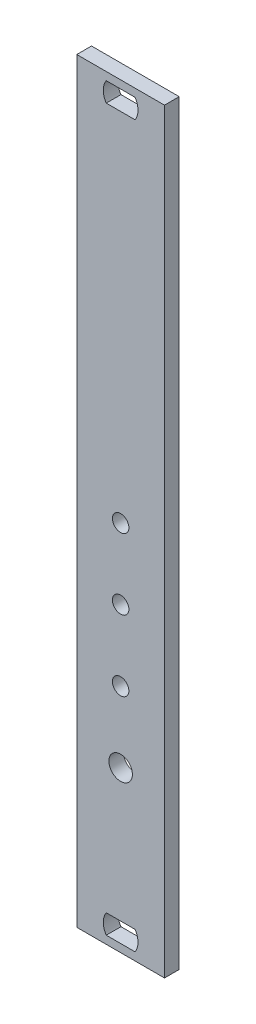
ISO-10303-21;
HEADER;
FILE_DESCRIPTION(('STEP AP214'),'2;1');
FILE_NAME('part.step','',(''),(''),'','','');
FILE_SCHEMA(('AUTOMOTIVE_DESIGN { 1 0 10303 214 1 1 1 1 }'));
ENDSEC;
DATA;
#1=APPLICATION_CONTEXT('core data for automotive mechanical design processes');
#2=APPLICATION_PROTOCOL_DEFINITION('international standard','automotive_design',2000,#1);
#3=PRODUCT_CONTEXT('',#1,'mechanical');
#4=PRODUCT('Part','Part','',(#3));
#5=PRODUCT_RELATED_PRODUCT_CATEGORY('part','',(#4));
#6=PRODUCT_DEFINITION_FORMATION('','',#4);
#7=PRODUCT_DEFINITION_CONTEXT('part definition',#1,'design');
#8=PRODUCT_DEFINITION('design','',#6,#7);
#9=PRODUCT_DEFINITION_SHAPE('','',#8);
#10=(LENGTH_UNIT() NAMED_UNIT(*) SI_UNIT(.MILLI.,.METRE.));
#11=(NAMED_UNIT(*) PLANE_ANGLE_UNIT() SI_UNIT($,.RADIAN.));
#12=(NAMED_UNIT(*) SI_UNIT($,.STERADIAN.) SOLID_ANGLE_UNIT());
#13=UNCERTAINTY_MEASURE_WITH_UNIT(LENGTH_MEASURE(1.E-05),#10,'distance_accuracy_value','');
#14=(GEOMETRIC_REPRESENTATION_CONTEXT(3) GLOBAL_UNCERTAINTY_ASSIGNED_CONTEXT((#13)) GLOBAL_UNIT_ASSIGNED_CONTEXT((#10,
#11,#12)) REPRESENTATION_CONTEXT('',''));
#15=CARTESIAN_POINT('',(0.,0.,0.));
#16=DIRECTION('',(0.,0.,1.));
#17=DIRECTION('',(1.,0.,0.));
#18=AXIS2_PLACEMENT_3D('',#15,#16,#17);
#19=CARTESIAN_POINT('',(0.,0.,2.5));
#20=DIRECTION('',(0.,0.,-1.));
#21=DIRECTION('',(-1.,0.,0.));
#22=AXIS2_PLACEMENT_3D('',#19,#20,#21);
#23=PLANE('',#22);
#24=CARTESIAN_POINT('',(7.45000000000001,27.2,2.5));
#25=DIRECTION('',(0.,0.,1.));
#26=DIRECTION('',(1.,0.,0.));
#27=AXIS2_PLACEMENT_3D('',#24,#25,#26);
#28=CIRCLE('',#27,2.);
#29=CARTESIAN_POINT('',(9.45,27.2,2.5));
#30=VERTEX_POINT('',#29);
#31=EDGE_CURVE('E321',#30,#30,#28,.T.);
#32=ORIENTED_EDGE('',*,*,#31,.F.);
#33=EDGE_LOOP('',(#32));
#34=FACE_BOUND('',#33,.T.);
#35=CARTESIAN_POINT('',(7.45,39.2,2.5));
#36=DIRECTION('',(0.,0.,1.));
#37=DIRECTION('',(1.,0.,0.));
#38=AXIS2_PLACEMENT_3D('',#35,#36,#37);
#39=CIRCLE('',#38,1.4);
#40=CARTESIAN_POINT('',(8.85,39.2,2.5));
#41=VERTEX_POINT('',#40);
#42=EDGE_CURVE('E323',#41,#41,#39,.T.);
#43=ORIENTED_EDGE('',*,*,#42,.F.);
#44=EDGE_LOOP('',(#43));
#45=FACE_BOUND('',#44,.T.);
#46=CARTESIAN_POINT('',(7.45,51.2,2.5));
#47=DIRECTION('',(0.,0.,1.));
#48=DIRECTION('',(1.,0.,0.));
#49=AXIS2_PLACEMENT_3D('',#46,#47,#48);
#50=CIRCLE('',#49,1.4);
#51=CARTESIAN_POINT('',(8.85,51.2,2.5));
#52=VERTEX_POINT('',#51);
#53=EDGE_CURVE('E329',#52,#52,#50,.T.);
#54=ORIENTED_EDGE('',*,*,#53,.F.);
#55=EDGE_LOOP('',(#54));
#56=FACE_BOUND('',#55,.T.);
#57=CARTESIAN_POINT('',(7.45,63.2,2.5));
#58=DIRECTION('',(0.,0.,1.));
#59=DIRECTION('',(1.,0.,0.));
#60=AXIS2_PLACEMENT_3D('',#57,#58,#59);
#61=CIRCLE('',#60,1.4);
#62=CARTESIAN_POINT('',(8.85,63.2,2.5));
#63=VERTEX_POINT('',#62);
#64=EDGE_CURVE('E335',#63,#63,#61,.T.);
#65=ORIENTED_EDGE('',*,*,#64,.F.);
#66=EDGE_LOOP('',(#65));
#67=FACE_BOUND('',#66,.T.);
#68=CARTESIAN_POINT('',(7.45000000000001,3.,2.5));
#69=DIRECTION('',(0.,0.,1.));
#70=DIRECTION('',(1.,0.,0.));
#71=AXIS2_PLACEMENT_3D('',#68,#69,#70);
#72=CIRCLE('',#71,2.95);
#73=CARTESIAN_POINT('',(5.00459614787252,4.65,2.5));
#74=VERTEX_POINT('',#73);
#75=CARTESIAN_POINT('',(5.00459614787252,1.35,2.5));
#76=VERTEX_POINT('',#75);
#77=EDGE_CURVE('E161',#74,#76,#72,.T.);
#78=ORIENTED_EDGE('',*,*,#77,.F.);
#79=DIRECTION('',(-1.,0.,0.));
#80=VECTOR('',#79,1.);
#81=CARTESIAN_POINT('',(5.00459614787252,4.65,2.5));
#82=LINE('',#81,#80);
#83=CARTESIAN_POINT('',(9.89540385212751,4.65,2.5));
#84=VERTEX_POINT('',#83);
#85=EDGE_CURVE('E169',#84,#74,#82,.T.);
#86=ORIENTED_EDGE('',*,*,#85,.F.);
#87=CARTESIAN_POINT('',(7.45000000000001,3.,2.5));
#88=DIRECTION('',(0.,0.,1.));
#89=DIRECTION('',(1.,0.,0.));
#90=AXIS2_PLACEMENT_3D('',#87,#88,#89);
#91=CIRCLE('',#90,2.95);
#92=CARTESIAN_POINT('',(9.89540385212751,1.35,2.5));
#93=VERTEX_POINT('',#92);
#94=EDGE_CURVE('E166',#93,#84,#91,.T.);
#95=ORIENTED_EDGE('',*,*,#94,.F.);
#96=DIRECTION('',(1.,0.,0.));
#97=VECTOR('',#96,1.);
#98=CARTESIAN_POINT('',(9.89540385212751,1.35,2.5));
#99=LINE('',#98,#97);
#100=EDGE_CURVE('E163',#76,#93,#99,.T.);
#101=ORIENTED_EDGE('',*,*,#100,.F.);
#102=EDGE_LOOP('',(#78,#86,#95,#101));
#103=FACE_BOUND('',#102,.T.);
#104=DIRECTION('',(0.,-1.,0.));
#105=VECTOR('',#104,1.);
#106=CARTESIAN_POINT('',(0.,0.,2.5));
#107=LINE('',#106,#105);
#108=CARTESIAN_POINT('',(0.,128.4,2.5));
#109=VERTEX_POINT('',#108);
#110=CARTESIAN_POINT('',(0.,0.,2.5));
#111=VERTEX_POINT('',#110);
#112=EDGE_CURVE('E192',#109,#111,#107,.T.);
#113=ORIENTED_EDGE('',*,*,#112,.T.);
#114=DIRECTION('',(1.,0.,0.));
#115=VECTOR('',#114,1.);
#116=CARTESIAN_POINT('',(14.9,0.,2.5));
#117=LINE('',#116,#115);
#118=CARTESIAN_POINT('',(14.9,0.,2.5));
#119=VERTEX_POINT('',#118);
#120=EDGE_CURVE('E195',#111,#119,#117,.T.);
#121=ORIENTED_EDGE('',*,*,#120,.T.);
#122=DIRECTION('',(0.,1.,0.));
#123=VECTOR('',#122,1.);
#124=CARTESIAN_POINT('',(14.9,128.4,2.5));
#125=LINE('',#124,#123);
#126=CARTESIAN_POINT('',(14.9,128.4,2.5));
#127=VERTEX_POINT('',#126);
#128=EDGE_CURVE('E198',#119,#127,#125,.T.);
#129=ORIENTED_EDGE('',*,*,#128,.T.);
#130=DIRECTION('',(-1.,0.,0.));
#131=VECTOR('',#130,1.);
#132=CARTESIAN_POINT('',(0.,128.4,2.5));
#133=LINE('',#132,#131);
#134=EDGE_CURVE('E200',#127,#109,#133,.T.);
#135=ORIENTED_EDGE('',*,*,#134,.T.);
#136=EDGE_LOOP('',(#113,#121,#129,#135));
#137=FACE_BOUND('',#136,.T.);
#138=CARTESIAN_POINT('',(7.45,125.4,2.5));
#139=DIRECTION('',(0.,0.,1.));
#140=DIRECTION('',(1.,0.,0.));
#141=AXIS2_PLACEMENT_3D('',#138,#139,#140);
#142=CIRCLE('',#141,2.95000000000001);
#143=CARTESIAN_POINT('',(5.00459614787251,127.05,2.5));
#144=VERTEX_POINT('',#143);
#145=CARTESIAN_POINT('',(5.00459614787247,123.75,2.5));
#146=VERTEX_POINT('',#145);
#147=EDGE_CURVE('E123',#144,#146,#142,.T.);
#148=ORIENTED_EDGE('',*,*,#147,.F.);
#149=DIRECTION('',(-1.,0.,0.));
#150=VECTOR('',#149,1.);
#151=CARTESIAN_POINT('',(5.00459614787251,127.05,2.5));
#152=LINE('',#151,#150);
#153=CARTESIAN_POINT('',(9.89540385212749,127.05,2.5));
#154=VERTEX_POINT('',#153);
#155=EDGE_CURVE('E145',#154,#144,#152,.T.);
#156=ORIENTED_EDGE('',*,*,#155,.F.);
#157=CARTESIAN_POINT('',(7.45,125.4,2.5));
#158=DIRECTION('',(0.,0.,1.));
#159=DIRECTION('',(1.,0.,0.));
#160=AXIS2_PLACEMENT_3D('',#157,#158,#159);
#161=CIRCLE('',#160,2.95000000000001);
#162=CARTESIAN_POINT('',(9.89540385212751,123.75,2.5));
#163=VERTEX_POINT('',#162);
#164=EDGE_CURVE('E143',#163,#154,#161,.T.);
#165=ORIENTED_EDGE('',*,*,#164,.F.);
#166=DIRECTION('',(1.,0.,0.));
#167=VECTOR('',#166,1.);
#168=CARTESIAN_POINT('',(9.89540385212753,123.75,2.5));
#169=LINE('',#168,#167);
#170=EDGE_CURVE('E131',#146,#163,#169,.T.);
#171=ORIENTED_EDGE('',*,*,#170,.F.);
#172=EDGE_LOOP('',(#148,#156,#165,#171));
#173=FACE_BOUND('',#172,.T.);
#174=ADVANCED_FACE('F34',(#34,#45,#56,#67,#103,#137,#173),#23,.F.);
#175=CARTESIAN_POINT('',(0.,0.,0.));
#176=DIRECTION('',(0.,0.,-1.));
#177=DIRECTION('',(-1.,0.,0.));
#178=AXIS2_PLACEMENT_3D('',#175,#176,#177);
#179=PLANE('',#178);
#180=CARTESIAN_POINT('',(7.45000000000001,27.2,0.));
#181=DIRECTION('',(0.,0.,1.));
#182=DIRECTION('',(1.,0.,0.));
#183=AXIS2_PLACEMENT_3D('',#180,#181,#182);
#184=CIRCLE('',#183,2.);
#185=CARTESIAN_POINT('',(9.45,27.2,0.));
#186=VERTEX_POINT('',#185);
#187=EDGE_CURVE('E319',#186,#186,#184,.T.);
#188=ORIENTED_EDGE('',*,*,#187,.T.);
#189=EDGE_LOOP('',(#188));
#190=FACE_BOUND('',#189,.T.);
#191=CARTESIAN_POINT('',(7.45,39.2,0.));
#192=DIRECTION('',(0.,0.,1.));
#193=DIRECTION('',(1.,0.,0.));
#194=AXIS2_PLACEMENT_3D('',#191,#192,#193);
#195=CIRCLE('',#194,1.4);
#196=CARTESIAN_POINT('',(8.85,39.2,0.));
#197=VERTEX_POINT('',#196);
#198=EDGE_CURVE('E326',#197,#197,#195,.T.);
#199=ORIENTED_EDGE('',*,*,#198,.T.);
#200=EDGE_LOOP('',(#199));
#201=FACE_BOUND('',#200,.T.);
#202=CARTESIAN_POINT('',(7.45,51.2,0.));
#203=DIRECTION('',(0.,0.,1.));
#204=DIRECTION('',(1.,0.,0.));
#205=AXIS2_PLACEMENT_3D('',#202,#203,#204);
#206=CIRCLE('',#205,1.4);
#207=CARTESIAN_POINT('',(8.85,51.2,0.));
#208=VERTEX_POINT('',#207);
#209=EDGE_CURVE('E332',#208,#208,#206,.T.);
#210=ORIENTED_EDGE('',*,*,#209,.T.);
#211=EDGE_LOOP('',(#210));
#212=FACE_BOUND('',#211,.T.);
#213=CARTESIAN_POINT('',(7.45,63.2,0.));
#214=DIRECTION('',(0.,0.,1.));
#215=DIRECTION('',(1.,0.,0.));
#216=AXIS2_PLACEMENT_3D('',#213,#214,#215);
#217=CIRCLE('',#216,1.4);
#218=CARTESIAN_POINT('',(8.85,63.2,0.));
#219=VERTEX_POINT('',#218);
#220=EDGE_CURVE('E151',#219,#219,#217,.T.);
#221=ORIENTED_EDGE('',*,*,#220,.T.);
#222=EDGE_LOOP('',(#221));
#223=FACE_BOUND('',#222,.T.);
#224=DIRECTION('',(-1.,0.,0.));
#225=VECTOR('',#224,1.);
#226=CARTESIAN_POINT('',(5.00459614787252,4.65,0.));
#227=LINE('',#226,#225);
#228=CARTESIAN_POINT('',(9.89540385212751,4.65,0.));
#229=VERTEX_POINT('',#228);
#230=CARTESIAN_POINT('',(5.00459614787252,4.65,0.));
#231=VERTEX_POINT('',#230);
#232=EDGE_CURVE('E164',#229,#231,#227,.T.);
#233=ORIENTED_EDGE('',*,*,#232,.T.);
#234=CARTESIAN_POINT('',(7.45000000000001,3.,0.));
#235=DIRECTION('',(0.,0.,1.));
#236=DIRECTION('',(1.,0.,0.));
#237=AXIS2_PLACEMENT_3D('',#234,#235,#236);
#238=CIRCLE('',#237,2.95);
#239=CARTESIAN_POINT('',(5.00459614787252,1.35,0.));
#240=VERTEX_POINT('',#239);
#241=EDGE_CURVE('E139',#231,#240,#238,.T.);
#242=ORIENTED_EDGE('',*,*,#241,.T.);
#243=DIRECTION('',(1.,0.,0.));
#244=VECTOR('',#243,1.);
#245=CARTESIAN_POINT('',(9.89540385212751,1.35,0.));
#246=LINE('',#245,#244);
#247=CARTESIAN_POINT('',(9.89540385212751,1.35,0.));
#248=VERTEX_POINT('',#247);
#249=EDGE_CURVE('E174',#240,#248,#246,.T.);
#250=ORIENTED_EDGE('',*,*,#249,.T.);
#251=CARTESIAN_POINT('',(7.45000000000001,3.,0.));
#252=DIRECTION('',(0.,0.,1.));
#253=DIRECTION('',(1.,0.,0.));
#254=AXIS2_PLACEMENT_3D('',#251,#252,#253);
#255=CIRCLE('',#254,2.95);
#256=EDGE_CURVE('E177',#248,#229,#255,.T.);
#257=ORIENTED_EDGE('',*,*,#256,.T.);
#258=EDGE_LOOP('',(#233,#242,#250,#257));
#259=FACE_BOUND('',#258,.T.);
#260=DIRECTION('',(0.,-1.,0.));
#261=VECTOR('',#260,1.);
#262=CARTESIAN_POINT('',(0.,0.,0.));
#263=LINE('',#262,#261);
#264=CARTESIAN_POINT('',(0.,128.4,0.));
#265=VERTEX_POINT('',#264);
#266=CARTESIAN_POINT('',(0.,0.,0.));
#267=VERTEX_POINT('',#266);
#268=EDGE_CURVE('E191',#265,#267,#263,.T.);
#269=ORIENTED_EDGE('',*,*,#268,.F.);
#270=DIRECTION('',(-1.,0.,0.));
#271=VECTOR('',#270,1.);
#272=CARTESIAN_POINT('',(0.,128.4,0.));
#273=LINE('',#272,#271);
#274=CARTESIAN_POINT('',(14.9,128.4,0.));
#275=VERTEX_POINT('',#274);
#276=EDGE_CURVE('E196',#275,#265,#273,.T.);
#277=ORIENTED_EDGE('',*,*,#276,.F.);
#278=DIRECTION('',(0.,1.,0.));
#279=VECTOR('',#278,1.);
#280=CARTESIAN_POINT('',(14.9,128.4,0.));
#281=LINE('',#280,#279);
#282=CARTESIAN_POINT('',(14.9,0.,0.));
#283=VERTEX_POINT('',#282);
#284=EDGE_CURVE('E207',#283,#275,#281,.T.);
#285=ORIENTED_EDGE('',*,*,#284,.F.);
#286=DIRECTION('',(1.,0.,0.));
#287=VECTOR('',#286,1.);
#288=CARTESIAN_POINT('',(14.9,0.,0.));
#289=LINE('',#288,#287);
#290=EDGE_CURVE('E205',#267,#283,#289,.T.);
#291=ORIENTED_EDGE('',*,*,#290,.F.);
#292=EDGE_LOOP('',(#269,#277,#285,#291));
#293=FACE_BOUND('',#292,.T.);
#294=DIRECTION('',(-1.,0.,0.));
#295=VECTOR('',#294,1.);
#296=CARTESIAN_POINT('',(5.00459614787251,127.05,0.));
#297=LINE('',#296,#295);
#298=CARTESIAN_POINT('',(9.89540385212749,127.05,0.));
#299=VERTEX_POINT('',#298);
#300=CARTESIAN_POINT('',(5.00459614787251,127.05,0.));
#301=VERTEX_POINT('',#300);
#302=EDGE_CURVE('E132',#299,#301,#297,.T.);
#303=ORIENTED_EDGE('',*,*,#302,.T.);
#304=CARTESIAN_POINT('',(7.45,125.4,0.));
#305=DIRECTION('',(0.,0.,1.));
#306=DIRECTION('',(1.,0.,0.));
#307=AXIS2_PLACEMENT_3D('',#304,#305,#306);
#308=CIRCLE('',#307,2.95000000000001);
#309=CARTESIAN_POINT('',(5.00459614787247,123.75,0.));
#310=VERTEX_POINT('',#309);
#311=EDGE_CURVE('E57',#301,#310,#308,.T.);
#312=ORIENTED_EDGE('',*,*,#311,.T.);
#313=DIRECTION('',(1.,0.,0.));
#314=VECTOR('',#313,1.);
#315=CARTESIAN_POINT('',(9.89540385212753,123.75,0.));
#316=LINE('',#315,#314);
#317=CARTESIAN_POINT('',(9.89540385212751,123.75,0.));
#318=VERTEX_POINT('',#317);
#319=EDGE_CURVE('E138',#310,#318,#316,.T.);
#320=ORIENTED_EDGE('',*,*,#319,.T.);
#321=CARTESIAN_POINT('',(7.45,125.4,0.));
#322=DIRECTION('',(0.,0.,1.));
#323=DIRECTION('',(1.,0.,0.));
#324=AXIS2_PLACEMENT_3D('',#321,#322,#323);
#325=CIRCLE('',#324,2.95000000000001);
#326=EDGE_CURVE('E153',#318,#299,#325,.T.);
#327=ORIENTED_EDGE('',*,*,#326,.T.);
#328=EDGE_LOOP('',(#303,#312,#320,#327));
#329=FACE_BOUND('',#328,.T.);
#330=ADVANCED_FACE('F225',(#190,#201,#212,#223,#259,#293,#329),#179,.T.);
#331=CARTESIAN_POINT('',(0.,0.,2.5));
#332=DIRECTION('',(1.,0.,0.));
#333=DIRECTION('',(0.,0.,-1.));
#334=AXIS2_PLACEMENT_3D('',#331,#332,#333);
#335=PLANE('',#334);
#336=ORIENTED_EDGE('',*,*,#268,.T.);
#337=DIRECTION('',(0.,0.,-1.));
#338=VECTOR('',#337,1.);
#339=CARTESIAN_POINT('',(0.,0.,2.5));
#340=LINE('',#339,#338);
#341=EDGE_CURVE('E11',#111,#267,#340,.T.);
#342=ORIENTED_EDGE('',*,*,#341,.F.);
#343=ORIENTED_EDGE('',*,*,#112,.F.);
#344=DIRECTION('',(0.,0.,-1.));
#345=VECTOR('',#344,1.);
#346=CARTESIAN_POINT('',(0.,128.4,2.5));
#347=LINE('',#346,#345);
#348=EDGE_CURVE('E202',#109,#265,#347,.T.);
#349=ORIENTED_EDGE('',*,*,#348,.T.);
#350=EDGE_LOOP('',(#336,#342,#343,#349));
#351=FACE_BOUND('',#350,.T.);
#352=ADVANCED_FACE('F36',(#351),#335,.F.);
#353=CARTESIAN_POINT('',(14.9,0.,2.5));
#354=DIRECTION('',(0.,1.,0.));
#355=DIRECTION('',(-1.,0.,0.));
#356=AXIS2_PLACEMENT_3D('',#353,#354,#355);
#357=PLANE('',#356);
#358=ORIENTED_EDGE('',*,*,#290,.T.);
#359=DIRECTION('',(0.,0.,-1.));
#360=VECTOR('',#359,1.);
#361=CARTESIAN_POINT('',(14.9,0.,2.5));
#362=LINE('',#361,#360);
#363=EDGE_CURVE('E42',#119,#283,#362,.T.);
#364=ORIENTED_EDGE('',*,*,#363,.F.);
#365=ORIENTED_EDGE('',*,*,#120,.F.);
#366=ORIENTED_EDGE('',*,*,#341,.T.);
#367=EDGE_LOOP('',(#358,#364,#365,#366));
#368=FACE_BOUND('',#367,.T.);
#369=ADVANCED_FACE('F235',(#368),#357,.F.);
#370=CARTESIAN_POINT('',(14.9,128.4,2.5));
#371=DIRECTION('',(-1.,0.,0.));
#372=DIRECTION('',(0.,-1.,0.));
#373=AXIS2_PLACEMENT_3D('',#370,#371,#372);
#374=PLANE('',#373);
#375=ORIENTED_EDGE('',*,*,#284,.T.);
#376=DIRECTION('',(0.,0.,-1.));
#377=VECTOR('',#376,1.);
#378=CARTESIAN_POINT('',(14.9,128.4,2.5));
#379=LINE('',#378,#377);
#380=EDGE_CURVE('E212',#127,#275,#379,.T.);
#381=ORIENTED_EDGE('',*,*,#380,.F.);
#382=ORIENTED_EDGE('',*,*,#128,.F.);
#383=ORIENTED_EDGE('',*,*,#363,.T.);
#384=EDGE_LOOP('',(#375,#381,#382,#383));
#385=FACE_BOUND('',#384,.T.);
#386=ADVANCED_FACE('F219',(#385),#374,.F.);
#387=CARTESIAN_POINT('',(0.,128.4,2.5));
#388=DIRECTION('',(0.,-1.,0.));
#389=DIRECTION('',(1.,0.,0.));
#390=AXIS2_PLACEMENT_3D('',#387,#388,#389);
#391=PLANE('',#390);
#392=ORIENTED_EDGE('',*,*,#276,.T.);
#393=ORIENTED_EDGE('',*,*,#348,.F.);
#394=ORIENTED_EDGE('',*,*,#134,.F.);
#395=ORIENTED_EDGE('',*,*,#380,.T.);
#396=EDGE_LOOP('',(#392,#393,#394,#395));
#397=FACE_BOUND('',#396,.T.);
#398=ADVANCED_FACE('F229',(#397),#391,.F.);
#399=CARTESIAN_POINT('',(7.45000000000001,3.,2.5));
#400=DIRECTION('',(0.,0.,-1.));
#401=DIRECTION('',(-1.,0.,0.));
#402=AXIS2_PLACEMENT_3D('',#399,#400,#401);
#403=CYLINDRICAL_SURFACE('',#402,2.95);
#404=ORIENTED_EDGE('',*,*,#241,.F.);
#405=DIRECTION('',(0.,0.,-1.));
#406=VECTOR('',#405,1.);
#407=CARTESIAN_POINT('',(5.00459614787252,4.65,2.5));
#408=LINE('',#407,#406);
#409=EDGE_CURVE('E171',#74,#231,#408,.T.);
#410=ORIENTED_EDGE('',*,*,#409,.F.);
#411=ORIENTED_EDGE('',*,*,#77,.T.);
#412=DIRECTION('',(0.,0.,-1.));
#413=VECTOR('',#412,1.);
#414=CARTESIAN_POINT('',(5.00459614787252,1.35,2.5));
#415=LINE('',#414,#413);
#416=EDGE_CURVE('E188',#76,#240,#415,.T.);
#417=ORIENTED_EDGE('',*,*,#416,.T.);
#418=EDGE_LOOP('',(#404,#410,#411,#417));
#419=FACE_BOUND('',#418,.T.);
#420=ADVANCED_FACE('F253',(#419),#403,.F.);
#421=CARTESIAN_POINT('',(9.89540385212751,1.35,2.5));
#422=DIRECTION('',(0.,1.,0.));
#423=DIRECTION('',(-1.,0.,0.));
#424=AXIS2_PLACEMENT_3D('',#421,#422,#423);
#425=PLANE('',#424);
#426=ORIENTED_EDGE('',*,*,#249,.F.);
#427=ORIENTED_EDGE('',*,*,#416,.F.);
#428=ORIENTED_EDGE('',*,*,#100,.T.);
#429=DIRECTION('',(0.,0.,-1.));
#430=VECTOR('',#429,1.);
#431=CARTESIAN_POINT('',(9.89540385212751,1.35,2.5));
#432=LINE('',#431,#430);
#433=EDGE_CURVE('E186',#93,#248,#432,.T.);
#434=ORIENTED_EDGE('',*,*,#433,.T.);
#435=EDGE_LOOP('',(#426,#427,#428,#434));
#436=FACE_BOUND('',#435,.T.);
#437=ADVANCED_FACE('F260',(#436),#425,.T.);
#438=CARTESIAN_POINT('',(7.45000000000001,3.,2.5));
#439=DIRECTION('',(0.,0.,-1.));
#440=DIRECTION('',(-1.,0.,0.));
#441=AXIS2_PLACEMENT_3D('',#438,#439,#440);
#442=CYLINDRICAL_SURFACE('',#441,2.95);
#443=ORIENTED_EDGE('',*,*,#256,.F.);
#444=ORIENTED_EDGE('',*,*,#433,.F.);
#445=ORIENTED_EDGE('',*,*,#94,.T.);
#446=DIRECTION('',(0.,0.,-1.));
#447=VECTOR('',#446,1.);
#448=CARTESIAN_POINT('',(9.89540385212751,4.65,2.5));
#449=LINE('',#448,#447);
#450=EDGE_CURVE('E184',#84,#229,#449,.T.);
#451=ORIENTED_EDGE('',*,*,#450,.T.);
#452=EDGE_LOOP('',(#443,#444,#445,#451));
#453=FACE_BOUND('',#452,.T.);
#454=ADVANCED_FACE('F265',(#453),#442,.F.);
#455=CARTESIAN_POINT('',(5.00459614787252,4.65,2.5));
#456=DIRECTION('',(0.,-1.,0.));
#457=DIRECTION('',(1.,0.,0.));
#458=AXIS2_PLACEMENT_3D('',#455,#456,#457);
#459=PLANE('',#458);
#460=ORIENTED_EDGE('',*,*,#232,.F.);
#461=ORIENTED_EDGE('',*,*,#450,.F.);
#462=ORIENTED_EDGE('',*,*,#85,.T.);
#463=ORIENTED_EDGE('',*,*,#409,.T.);
#464=EDGE_LOOP('',(#460,#461,#462,#463));
#465=FACE_BOUND('',#464,.T.);
#466=ADVANCED_FACE('F273',(#465),#459,.T.);
#467=CARTESIAN_POINT('',(7.45,125.4,2.5));
#468=DIRECTION('',(0.,0.,-1.));
#469=DIRECTION('',(-1.,0.,0.));
#470=AXIS2_PLACEMENT_3D('',#467,#468,#469);
#471=CYLINDRICAL_SURFACE('',#470,2.95000000000001);
#472=ORIENTED_EDGE('',*,*,#311,.F.);
#473=DIRECTION('',(0.,0.,-1.));
#474=VECTOR('',#473,1.);
#475=CARTESIAN_POINT('',(5.00459614787251,127.05,2.5));
#476=LINE('',#475,#474);
#477=EDGE_CURVE('E127',#144,#301,#476,.T.);
#478=ORIENTED_EDGE('',*,*,#477,.F.);
#479=ORIENTED_EDGE('',*,*,#147,.T.);
#480=DIRECTION('',(0.,0.,-1.));
#481=VECTOR('',#480,1.);
#482=CARTESIAN_POINT('',(5.00459614787247,123.75,2.5));
#483=LINE('',#482,#481);
#484=EDGE_CURVE('E126',#146,#310,#483,.T.);
#485=ORIENTED_EDGE('',*,*,#484,.T.);
#486=EDGE_LOOP('',(#472,#478,#479,#485));
#487=FACE_BOUND('',#486,.T.);
#488=ADVANCED_FACE('F125',(#487),#471,.F.);
#489=CARTESIAN_POINT('',(9.89540385212753,123.75,2.5));
#490=DIRECTION('',(0.,1.,0.));
#491=DIRECTION('',(0.,0.,1.));
#492=AXIS2_PLACEMENT_3D('',#489,#490,#491);
#493=PLANE('',#492);
#494=ORIENTED_EDGE('',*,*,#319,.F.);
#495=ORIENTED_EDGE('',*,*,#484,.F.);
#496=ORIENTED_EDGE('',*,*,#170,.T.);
#497=DIRECTION('',(0.,0.,-1.));
#498=VECTOR('',#497,1.);
#499=CARTESIAN_POINT('',(9.89540385212751,123.75,2.5));
#500=LINE('',#499,#498);
#501=EDGE_CURVE('E140',#163,#318,#500,.T.);
#502=ORIENTED_EDGE('',*,*,#501,.T.);
#503=EDGE_LOOP('',(#494,#495,#496,#502));
#504=FACE_BOUND('',#503,.T.);
#505=ADVANCED_FACE('F135',(#504),#493,.T.);
#506=CARTESIAN_POINT('',(7.45,125.4,2.5));
#507=DIRECTION('',(0.,0.,-1.));
#508=DIRECTION('',(-1.,0.,0.));
#509=AXIS2_PLACEMENT_3D('',#506,#507,#508);
#510=CYLINDRICAL_SURFACE('',#509,2.95000000000001);
#511=ORIENTED_EDGE('',*,*,#326,.F.);
#512=ORIENTED_EDGE('',*,*,#501,.F.);
#513=ORIENTED_EDGE('',*,*,#164,.T.);
#514=DIRECTION('',(0.,0.,-1.));
#515=VECTOR('',#514,1.);
#516=CARTESIAN_POINT('',(9.89540385212749,127.05,2.5));
#517=LINE('',#516,#515);
#518=EDGE_CURVE('E49',#154,#299,#517,.T.);
#519=ORIENTED_EDGE('',*,*,#518,.T.);
#520=EDGE_LOOP('',(#511,#512,#513,#519));
#521=FACE_BOUND('',#520,.T.);
#522=ADVANCED_FACE('F292',(#521),#510,.F.);
#523=CARTESIAN_POINT('',(5.00459614787251,127.05,2.5));
#524=DIRECTION('',(0.,-1.,0.));
#525=DIRECTION('',(0.,0.,-1.));
#526=AXIS2_PLACEMENT_3D('',#523,#524,#525);
#527=PLANE('',#526);
#528=ORIENTED_EDGE('',*,*,#302,.F.);
#529=ORIENTED_EDGE('',*,*,#518,.F.);
#530=ORIENTED_EDGE('',*,*,#155,.T.);
#531=ORIENTED_EDGE('',*,*,#477,.T.);
#532=EDGE_LOOP('',(#528,#529,#530,#531));
#533=FACE_BOUND('',#532,.T.);
#534=ADVANCED_FACE('F295',(#533),#527,.T.);
#535=CARTESIAN_POINT('',(7.45,63.2,0.));
#536=DIRECTION('',(0.,0.,1.));
#537=DIRECTION('',(1.,0.,0.));
#538=AXIS2_PLACEMENT_3D('',#535,#536,#537);
#539=CYLINDRICAL_SURFACE('',#538,1.4);
#540=ORIENTED_EDGE('',*,*,#220,.F.);
#541=EDGE_LOOP('',(#540));
#542=FACE_BOUND('',#541,.T.);
#543=ORIENTED_EDGE('',*,*,#64,.T.);
#544=EDGE_LOOP('',(#543));
#545=FACE_BOUND('',#544,.T.);
#546=ADVANCED_FACE('F299',(#542,#545),#539,.F.);
#547=CARTESIAN_POINT('',(7.45,51.2,0.));
#548=DIRECTION('',(0.,0.,1.));
#549=DIRECTION('',(1.,0.,0.));
#550=AXIS2_PLACEMENT_3D('',#547,#548,#549);
#551=CYLINDRICAL_SURFACE('',#550,1.4);
#552=ORIENTED_EDGE('',*,*,#209,.F.);
#553=EDGE_LOOP('',(#552));
#554=FACE_BOUND('',#553,.T.);
#555=ORIENTED_EDGE('',*,*,#53,.T.);
#556=EDGE_LOOP('',(#555));
#557=FACE_BOUND('',#556,.T.);
#558=ADVANCED_FACE('F302',(#554,#557),#551,.F.);
#559=CARTESIAN_POINT('',(7.45,39.2,0.));
#560=DIRECTION('',(0.,0.,1.));
#561=DIRECTION('',(1.,0.,0.));
#562=AXIS2_PLACEMENT_3D('',#559,#560,#561);
#563=CYLINDRICAL_SURFACE('',#562,1.4);
#564=ORIENTED_EDGE('',*,*,#198,.F.);
#565=EDGE_LOOP('',(#564));
#566=FACE_BOUND('',#565,.T.);
#567=ORIENTED_EDGE('',*,*,#42,.T.);
#568=EDGE_LOOP('',(#567));
#569=FACE_BOUND('',#568,.T.);
#570=ADVANCED_FACE('F306',(#566,#569),#563,.F.);
#571=CARTESIAN_POINT('',(7.45000000000001,27.2,0.));
#572=DIRECTION('',(0.,0.,1.));
#573=DIRECTION('',(1.,0.,0.));
#574=AXIS2_PLACEMENT_3D('',#571,#572,#573);
#575=CYLINDRICAL_SURFACE('',#574,2.);
#576=ORIENTED_EDGE('',*,*,#187,.F.);
#577=EDGE_LOOP('',(#576));
#578=FACE_BOUND('',#577,.T.);
#579=ORIENTED_EDGE('',*,*,#31,.T.);
#580=EDGE_LOOP('',(#579));
#581=FACE_BOUND('',#580,.T.);
#582=ADVANCED_FACE('F310',(#578,#581),#575,.F.);
#583=CLOSED_SHELL('',(#174,#330,#352,#369,#386,#398,#420,#437,#454,#466,#488,#505,#522,#534,
#546,#558,#570,#582));
#584=MANIFOLD_SOLID_BREP('B2',#583);
#585=ADVANCED_BREP_SHAPE_REPRESENTATION('',(#18,#584),#14);
#586=SHAPE_DEFINITION_REPRESENTATION(#9,#585);
ENDSEC;
END-ISO-10303-21;
